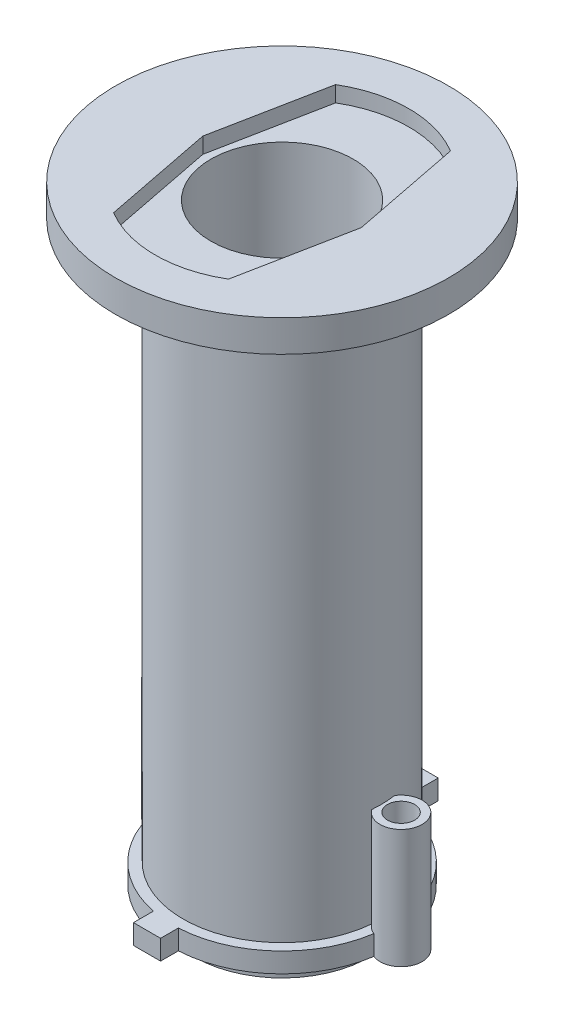
ISO-10303-21;
HEADER;
FILE_DESCRIPTION(('STEP AP214'),'2;1');
FILE_NAME('part.step','',(''),(''),'','','');
FILE_SCHEMA(('AUTOMOTIVE_DESIGN { 1 0 10303 214 1 1 1 1 }'));
ENDSEC;
DATA;
#1=APPLICATION_CONTEXT('core data for automotive mechanical design processes');
#2=APPLICATION_PROTOCOL_DEFINITION('international standard','automotive_design',2000,#1);
#3=PRODUCT_CONTEXT('',#1,'mechanical');
#4=PRODUCT('Part','Part','',(#3));
#5=PRODUCT_RELATED_PRODUCT_CATEGORY('part','',(#4));
#6=PRODUCT_DEFINITION_FORMATION('','',#4);
#7=PRODUCT_DEFINITION_CONTEXT('part definition',#1,'design');
#8=PRODUCT_DEFINITION('design','',#6,#7);
#9=PRODUCT_DEFINITION_SHAPE('','',#8);
#10=(LENGTH_UNIT() NAMED_UNIT(*) SI_UNIT(.MILLI.,.METRE.));
#11=(NAMED_UNIT(*) PLANE_ANGLE_UNIT() SI_UNIT($,.RADIAN.));
#12=(NAMED_UNIT(*) SI_UNIT($,.STERADIAN.) SOLID_ANGLE_UNIT());
#13=UNCERTAINTY_MEASURE_WITH_UNIT(LENGTH_MEASURE(1.E-05),#10,'distance_accuracy_value','');
#14=(GEOMETRIC_REPRESENTATION_CONTEXT(3) GLOBAL_UNCERTAINTY_ASSIGNED_CONTEXT((#13)) GLOBAL_UNIT_ASSIGNED_CONTEXT((#10,
#11,#12)) REPRESENTATION_CONTEXT('',''));
#15=CARTESIAN_POINT('',(0.,0.,0.));
#16=DIRECTION('',(0.,0.,1.));
#17=DIRECTION('',(1.,0.,0.));
#18=AXIS2_PLACEMENT_3D('',#15,#16,#17);
#19=CARTESIAN_POINT('',(-0.0762000000000037,2.5,1.51384));
#20=DIRECTION('',(0.,1.,0.));
#21=DIRECTION('',(0.,0.,1.));
#22=AXIS2_PLACEMENT_3D('',#19,#20,#21);
#23=PLANE('',#22);
#24=CARTESIAN_POINT('',(-14.5034,2.5,1.0795));
#25=DIRECTION('',(0.,1.,0.));
#26=DIRECTION('',(0.,0.,1.));
#27=AXIS2_PLACEMENT_3D('',#24,#25,#26);
#28=CIRCLE('',#27,2.6543);
#29=CARTESIAN_POINT('',(-12.3886077372189,2.5,-0.524545565213582));
#30=VERTEX_POINT('',#29);
#31=CARTESIAN_POINT('',(-13.5330312519173,2.5,-1.39106531642952));
#32=VERTEX_POINT('',#31);
#33=EDGE_CURVE('E272',#30,#32,#28,.T.);
#34=ORIENTED_EDGE('',*,*,#33,.F.);
#35=CARTESIAN_POINT('',(-0.0762000000000037,2.5,1.51384));
#36=DIRECTION('',(0.,1.,0.));
#37=DIRECTION('',(0.,0.,1.));
#38=AXIS2_PLACEMENT_3D('',#35,#36,#37);
#39=CIRCLE('',#38,12.48);
#40=CARTESIAN_POINT('',(12.2644264634765,2.5,-0.346089700000451));
#41=VERTEX_POINT('',#40);
#42=EDGE_CURVE('E417',#41,#30,#39,.T.);
#43=ORIENTED_EDGE('',*,*,#42,.F.);
#44=CARTESIAN_POINT('',(14.5034,2.5,1.0795));
#45=DIRECTION('',(0.,1.,0.));
#46=DIRECTION('',(0.,0.,1.));
#47=AXIS2_PLACEMENT_3D('',#44,#45,#46);
#48=CIRCLE('',#47,2.65430000000001);
#49=CARTESIAN_POINT('',(13.3933444870035,2.5,-1.33153406198795));
#50=VERTEX_POINT('',#49);
#51=EDGE_CURVE('E268',#50,#41,#48,.T.);
#52=ORIENTED_EDGE('',*,*,#51,.F.);
#53=CARTESIAN_POINT('',(-0.0762000000000037,2.5,1.51384));
#54=DIRECTION('',(0.,1.,0.));
#55=DIRECTION('',(0.,0.,1.));
#56=AXIS2_PLACEMENT_3D('',#53,#54,#55);
#57=CIRCLE('',#56,13.7668);
#58=CARTESIAN_POINT('',(0.597960957999996,2.5,-12.2364432422721));
#59=VERTEX_POINT('',#58);
#60=EDGE_CURVE('E191',#50,#59,#57,.T.);
#61=ORIENTED_EDGE('',*,*,#60,.T.);
#62=DIRECTION('',(0.,0.,-1.));
#63=VECTOR('',#62,1.);
#64=CARTESIAN_POINT('',(0.597960957999996,2.5,-12.2364432422721));
#65=LINE('',#64,#63);
#66=CARTESIAN_POINT('',(0.597960957999998,2.5,-17.5133));
#67=VERTEX_POINT('',#66);
#68=EDGE_CURVE('E113',#59,#67,#65,.T.);
#69=ORIENTED_EDGE('',*,*,#68,.T.);
#70=DIRECTION('',(-1.,0.,0.));
#71=VECTOR('',#70,1.);
#72=CARTESIAN_POINT('',(0.597960957999998,2.5,-17.5133));
#73=LINE('',#72,#71);
#74=CARTESIAN_POINT('',(-2.819411684,2.5,-17.5133));
#75=VERTEX_POINT('',#74);
#76=EDGE_CURVE('E238',#67,#75,#73,.T.);
#77=ORIENTED_EDGE('',*,*,#76,.T.);
#78=DIRECTION('',(0.,0.,1.));
#79=VECTOR('',#78,1.);
#80=CARTESIAN_POINT('',(-2.819411684,2.5,-17.5133));
#81=LINE('',#80,#79);
#82=CARTESIAN_POINT('',(-2.819411684,2.5,-11.9768816966612));
#83=VERTEX_POINT('',#82);
#84=EDGE_CURVE('E233',#75,#83,#81,.T.);
#85=ORIENTED_EDGE('',*,*,#84,.T.);
#86=CARTESIAN_POINT('',(-0.0762000000000037,2.5,1.51384));
#87=DIRECTION('',(0.,1.,0.));
#88=DIRECTION('',(0.,0.,1.));
#89=AXIS2_PLACEMENT_3D('',#86,#87,#88);
#90=CIRCLE('',#89,13.7668);
#91=EDGE_CURVE('E237',#83,#32,#90,.T.);
#92=ORIENTED_EDGE('',*,*,#91,.T.);
#93=EDGE_LOOP('',(#34,#43,#52,#61,#69,#77,#85,#92));
#94=FACE_BOUND('',#93,.T.);
#95=ADVANCED_FACE('F35',(#94),#23,.T.);
#96=CARTESIAN_POINT('',(12.3532611180342,2.5,2.63584548807739));
#97=VERTEX_POINT('',#96);
#98=CARTESIAN_POINT('',(13.5388396547462,2.5,3.55233882013443));
#99=VERTEX_POINT('',#98);
#100=EDGE_CURVE('E59',#97,#99,#48,.T.);
#101=ORIENTED_EDGE('',*,*,#100,.F.);
#102=CARTESIAN_POINT('',(-12.4889319057638,2.5,2.80785956539843));
#103=VERTEX_POINT('',#102);
#104=EDGE_CURVE('E264',#103,#97,#39,.T.);
#105=ORIENTED_EDGE('',*,*,#104,.F.);
#106=CARTESIAN_POINT('',(-13.6834098116879,2.5,3.60396520694422));
#107=VERTEX_POINT('',#106);
#108=EDGE_CURVE('E250',#107,#103,#28,.T.);
#109=ORIENTED_EDGE('',*,*,#108,.F.);
#110=CARTESIAN_POINT('',(-0.0762000000000037,2.5,1.51384));
#111=DIRECTION('',(0.,1.,0.));
#112=DIRECTION('',(0.,0.,1.));
#113=AXIS2_PLACEMENT_3D('',#110,#111,#112);
#114=CIRCLE('',#113,13.7668);
#115=CARTESIAN_POINT('',(-2.81941168400001,2.5,15.0045616966612));
#116=VERTEX_POINT('',#115);
#117=EDGE_CURVE('E240',#107,#116,#114,.T.);
#118=ORIENTED_EDGE('',*,*,#117,.T.);
#119=DIRECTION('',(0.,0.,1.));
#120=VECTOR('',#119,1.);
#121=CARTESIAN_POINT('',(-2.81941168400001,2.5,15.0045616966612));
#122=LINE('',#121,#120);
#123=CARTESIAN_POINT('',(-2.819411684,2.5,17.5133));
#124=VERTEX_POINT('',#123);
#125=EDGE_CURVE('E143',#116,#124,#122,.T.);
#126=ORIENTED_EDGE('',*,*,#125,.T.);
#127=DIRECTION('',(1.,0.,0.));
#128=VECTOR('',#127,1.);
#129=CARTESIAN_POINT('',(-2.819411684,2.5,17.5133));
#130=LINE('',#129,#128);
#131=CARTESIAN_POINT('',(0.597960957999998,2.5,17.5133));
#132=VERTEX_POINT('',#131);
#133=EDGE_CURVE('E136',#124,#132,#130,.T.);
#134=ORIENTED_EDGE('',*,*,#133,.T.);
#135=DIRECTION('',(0.,0.,-1.));
#136=VECTOR('',#135,1.);
#137=CARTESIAN_POINT('',(0.597960957999998,2.5,17.5133));
#138=LINE('',#137,#136);
#139=CARTESIAN_POINT('',(0.597960957999998,2.5,15.2641232422721));
#140=VERTEX_POINT('',#139);
#141=EDGE_CURVE('E140',#132,#140,#138,.T.);
#142=ORIENTED_EDGE('',*,*,#141,.T.);
#143=CARTESIAN_POINT('',(-0.0762000000000037,2.5,1.51384));
#144=DIRECTION('',(0.,1.,0.));
#145=DIRECTION('',(0.,0.,1.));
#146=AXIS2_PLACEMENT_3D('',#143,#144,#145);
#147=CIRCLE('',#146,13.7668);
#148=EDGE_CURVE('E161',#140,#99,#147,.T.);
#149=ORIENTED_EDGE('',*,*,#148,.T.);
#150=EDGE_LOOP('',(#101,#105,#109,#118,#126,#134,#142,#149));
#151=FACE_BOUND('',#150,.T.);
#152=ADVANCED_FACE('F138',(#151),#23,.T.);
#153=CARTESIAN_POINT('',(-14.5034,2.5,1.0795));
#154=DIRECTION('',(0.,-1.,0.));
#155=DIRECTION('',(0.,0.,-1.));
#156=AXIS2_PLACEMENT_3D('',#153,#154,#155);
#157=CYLINDRICAL_SURFACE('',#156,2.6543);
#158=DIRECTION('',(0.,-1.,0.));
#159=VECTOR('',#158,1.);
#160=CARTESIAN_POINT('',(-12.4889319057638,19.1525,2.80785956539843));
#161=LINE('',#160,#159);
#162=CARTESIAN_POINT('',(-12.4889319057638,15.,2.80785956539843));
#163=VERTEX_POINT('',#162);
#164=EDGE_CURVE('E406',#163,#103,#161,.T.);
#165=ORIENTED_EDGE('',*,*,#164,.F.);
#166=CARTESIAN_POINT('',(-14.5034,15.,1.0795));
#167=DIRECTION('',(0.,-1.,0.));
#168=DIRECTION('',(0.,0.,-1.));
#169=AXIS2_PLACEMENT_3D('',#166,#167,#168);
#170=CIRCLE('',#169,2.6543);
#171=CARTESIAN_POINT('',(-12.3886077372189,15.,-0.524545565213582));
#172=VERTEX_POINT('',#171);
#173=EDGE_CURVE('E418',#163,#172,#170,.T.);
#174=ORIENTED_EDGE('',*,*,#173,.T.);
#175=DIRECTION('',(0.,-1.,0.));
#176=VECTOR('',#175,1.);
#177=CARTESIAN_POINT('',(-12.3886077372189,19.1525,-0.524545565213585));
#178=LINE('',#177,#176);
#179=EDGE_CURVE('E411',#30,#172,#178,.F.);
#180=ORIENTED_EDGE('',*,*,#179,.F.);
#181=ORIENTED_EDGE('',*,*,#33,.T.);
#182=DIRECTION('',(0.,-1.,0.));
#183=VECTOR('',#182,1.);
#184=CARTESIAN_POINT('',(-13.5330312519173,2.5,-1.39106531642952));
#185=LINE('',#184,#183);
#186=CARTESIAN_POINT('',(-13.5330312519173,0.,-1.39106531642952));
#187=VERTEX_POINT('',#186);
#188=EDGE_CURVE('E203',#32,#187,#185,.T.);
#189=ORIENTED_EDGE('',*,*,#188,.T.);
#190=CARTESIAN_POINT('',(-14.5034,0.,1.0795));
#191=DIRECTION('',(0.,1.,0.));
#192=DIRECTION('',(0.,0.,1.));
#193=AXIS2_PLACEMENT_3D('',#190,#191,#192);
#194=CIRCLE('',#193,2.6543);
#195=CARTESIAN_POINT('',(-13.6834098116879,0.,3.60396520694422));
#196=VERTEX_POINT('',#195);
#197=EDGE_CURVE('E179',#187,#196,#194,.T.);
#198=ORIENTED_EDGE('',*,*,#197,.T.);
#199=DIRECTION('',(0.,-1.,0.));
#200=VECTOR('',#199,1.);
#201=CARTESIAN_POINT('',(-13.6834098116879,2.5,3.60396520694422));
#202=LINE('',#201,#200);
#203=EDGE_CURVE('E200',#107,#196,#202,.T.);
#204=ORIENTED_EDGE('',*,*,#203,.F.);
#205=ORIENTED_EDGE('',*,*,#108,.T.);
#206=EDGE_LOOP('',(#165,#174,#180,#181,#189,#198,#204,#205));
#207=FACE_BOUND('',#206,.T.);
#208=ADVANCED_FACE('F446',(#207),#157,.T.);
#209=CARTESIAN_POINT('',(14.5034,2.5,1.0795));
#210=DIRECTION('',(0.,-1.,0.));
#211=DIRECTION('',(0.,0.,-1.));
#212=AXIS2_PLACEMENT_3D('',#209,#210,#211);
#213=CYLINDRICAL_SURFACE('',#212,2.6543);
#214=DIRECTION('',(0.,-1.,0.));
#215=VECTOR('',#214,1.);
#216=CARTESIAN_POINT('',(12.2644264634765,19.1525,-0.346089700000466));
#217=LINE('',#216,#215);
#218=CARTESIAN_POINT('',(12.2644264634765,15.,-0.346089700000459));
#219=VERTEX_POINT('',#218);
#220=EDGE_CURVE('E294',#219,#41,#217,.T.);
#221=ORIENTED_EDGE('',*,*,#220,.F.);
#222=CARTESIAN_POINT('',(14.5034,15.,1.0795));
#223=DIRECTION('',(0.,-1.,0.));
#224=DIRECTION('',(0.,0.,-1.));
#225=AXIS2_PLACEMENT_3D('',#222,#223,#224);
#226=CIRCLE('',#225,2.6543);
#227=CARTESIAN_POINT('',(12.3532611180342,15.,2.6358454880774));
#228=VERTEX_POINT('',#227);
#229=EDGE_CURVE('E423',#219,#228,#226,.T.);
#230=ORIENTED_EDGE('',*,*,#229,.T.);
#231=DIRECTION('',(0.,-1.,0.));
#232=VECTOR('',#231,1.);
#233=CARTESIAN_POINT('',(12.3532611180342,19.1525,2.63584548807741));
#234=LINE('',#233,#232);
#235=EDGE_CURVE('E408',#97,#228,#234,.F.);
#236=ORIENTED_EDGE('',*,*,#235,.F.);
#237=ORIENTED_EDGE('',*,*,#100,.T.);
#238=DIRECTION('',(0.,-1.,0.));
#239=VECTOR('',#238,1.);
#240=CARTESIAN_POINT('',(13.5388396547462,2.5,3.55233882013443));
#241=LINE('',#240,#239);
#242=CARTESIAN_POINT('',(13.5388396547462,0.,3.55233882013443));
#243=VERTEX_POINT('',#242);
#244=EDGE_CURVE('E193',#99,#243,#241,.T.);
#245=ORIENTED_EDGE('',*,*,#244,.T.);
#246=CARTESIAN_POINT('',(14.5034,0.,1.0795));
#247=DIRECTION('',(0.,1.,0.));
#248=DIRECTION('',(0.,0.,1.));
#249=AXIS2_PLACEMENT_3D('',#246,#247,#248);
#250=CIRCLE('',#249,2.6543);
#251=CARTESIAN_POINT('',(13.3933444870035,0.,-1.33153406198795));
#252=VERTEX_POINT('',#251);
#253=EDGE_CURVE('E104',#243,#252,#250,.T.);
#254=ORIENTED_EDGE('',*,*,#253,.T.);
#255=DIRECTION('',(0.,-1.,0.));
#256=VECTOR('',#255,1.);
#257=CARTESIAN_POINT('',(13.3933444870035,2.5,-1.33153406198795));
#258=LINE('',#257,#256);
#259=EDGE_CURVE('E163',#50,#252,#258,.T.);
#260=ORIENTED_EDGE('',*,*,#259,.F.);
#261=ORIENTED_EDGE('',*,*,#51,.T.);
#262=EDGE_LOOP('',(#221,#230,#236,#237,#245,#254,#260,#261));
#263=FACE_BOUND('',#262,.T.);
#264=ADVANCED_FACE('F290',(#263),#213,.T.);
#265=CARTESIAN_POINT('',(-0.0762000000000037,72.805,1.51384));
#266=DIRECTION('',(0.,1.,0.));
#267=DIRECTION('',(0.,0.,1.));
#268=AXIS2_PLACEMENT_3D('',#265,#266,#267);
#269=PLANE('',#268);
#270=CARTESIAN_POINT('',(-0.0762000000000037,72.805,1.51384));
#271=DIRECTION('',(0.,1.,0.));
#272=DIRECTION('',(0.,0.,1.));
#273=AXIS2_PLACEMENT_3D('',#270,#271,#272);
#274=CIRCLE('',#273,21.);
#275=CARTESIAN_POINT('',(-0.0762000000000037,72.805,22.51384));
#276=VERTEX_POINT('',#275);
#277=EDGE_CURVE('E274',#276,#276,#274,.T.);
#278=ORIENTED_EDGE('',*,*,#277,.F.);
#279=EDGE_LOOP('',(#278));
#280=FACE_BOUND('',#279,.T.);
#281=CARTESIAN_POINT('',(-0.0762000000000037,72.805,1.51384));
#282=DIRECTION('',(0.,1.,0.));
#283=DIRECTION('',(0.,0.,1.));
#284=AXIS2_PLACEMENT_3D('',#281,#282,#283);
#285=CIRCLE('',#284,12.48);
#286=CARTESIAN_POINT('',(-0.0762000000000037,72.805,13.99384));
#287=VERTEX_POINT('',#286);
#288=EDGE_CURVE('E415',#287,#287,#285,.T.);
#289=ORIENTED_EDGE('',*,*,#288,.T.);
#290=EDGE_LOOP('',(#289));
#291=FACE_BOUND('',#290,.T.);
#292=ADVANCED_FACE('F476',(#280,#291),#269,.F.);
#293=CARTESIAN_POINT('',(-0.0762000000000037,2.5,1.51384));
#294=DIRECTION('',(0.,-1.,0.));
#295=DIRECTION('',(0.,0.,-1.));
#296=AXIS2_PLACEMENT_3D('',#293,#294,#295);
#297=CYLINDRICAL_SURFACE('',#296,13.7668);
#298=CARTESIAN_POINT('',(-0.0762000000000037,0.,1.51384));
#299=DIRECTION('',(0.,1.,0.));
#300=DIRECTION('',(0.,0.,1.));
#301=AXIS2_PLACEMENT_3D('',#298,#299,#300);
#302=CIRCLE('',#301,13.7668);
#303=CARTESIAN_POINT('',(0.597960957999996,0.,-12.2364432422721));
#304=VERTEX_POINT('',#303);
#305=EDGE_CURVE('E167',#252,#304,#302,.T.);
#306=ORIENTED_EDGE('',*,*,#305,.T.);
#307=DIRECTION('',(0.,-1.,0.));
#308=VECTOR('',#307,1.);
#309=CARTESIAN_POINT('',(0.597960957999996,2.5,-12.2364432422721));
#310=LINE('',#309,#308);
#311=EDGE_CURVE('E43',#59,#304,#310,.T.);
#312=ORIENTED_EDGE('',*,*,#311,.F.);
#313=ORIENTED_EDGE('',*,*,#60,.F.);
#314=ORIENTED_EDGE('',*,*,#259,.T.);
#315=EDGE_LOOP('',(#306,#312,#313,#314));
#316=FACE_BOUND('',#315,.T.);
#317=ADVANCED_FACE('F37',(#316),#297,.T.);
#318=CARTESIAN_POINT('',(0.597960957999996,2.5,-12.2364432422721));
#319=DIRECTION('',(-1.,0.,0.));
#320=DIRECTION('',(0.,0.,1.));
#321=AXIS2_PLACEMENT_3D('',#318,#319,#320);
#322=PLANE('',#321);
#323=DIRECTION('',(0.,0.,-1.));
#324=VECTOR('',#323,1.);
#325=CARTESIAN_POINT('',(0.597960957999996,0.,-12.2364432422721));
#326=LINE('',#325,#324);
#327=CARTESIAN_POINT('',(0.597960957999998,0.,-17.5133));
#328=VERTEX_POINT('',#327);
#329=EDGE_CURVE('E170',#304,#328,#326,.T.);
#330=ORIENTED_EDGE('',*,*,#329,.T.);
#331=DIRECTION('',(0.,-1.,0.));
#332=VECTOR('',#331,1.);
#333=CARTESIAN_POINT('',(0.597960957999998,2.5,-17.5133));
#334=LINE('',#333,#332);
#335=EDGE_CURVE('E212',#67,#328,#334,.T.);
#336=ORIENTED_EDGE('',*,*,#335,.F.);
#337=ORIENTED_EDGE('',*,*,#68,.F.);
#338=ORIENTED_EDGE('',*,*,#311,.T.);
#339=EDGE_LOOP('',(#330,#336,#337,#338));
#340=FACE_BOUND('',#339,.T.);
#341=ADVANCED_FACE('F215',(#340),#322,.F.);
#342=CARTESIAN_POINT('',(0.597960957999998,2.5,-17.5133));
#343=DIRECTION('',(0.,0.,1.));
#344=DIRECTION('',(1.,0.,0.));
#345=AXIS2_PLACEMENT_3D('',#342,#343,#344);
#346=PLANE('',#345);
#347=DIRECTION('',(-1.,0.,0.));
#348=VECTOR('',#347,1.);
#349=CARTESIAN_POINT('',(0.597960957999998,0.,-17.5133));
#350=LINE('',#349,#348);
#351=CARTESIAN_POINT('',(-2.819411684,0.,-17.5133));
#352=VERTEX_POINT('',#351);
#353=EDGE_CURVE('E173',#328,#352,#350,.T.);
#354=ORIENTED_EDGE('',*,*,#353,.T.);
#355=DIRECTION('',(0.,-1.,0.));
#356=VECTOR('',#355,1.);
#357=CARTESIAN_POINT('',(-2.819411684,2.5,-17.5133));
#358=LINE('',#357,#356);
#359=EDGE_CURVE('E209',#75,#352,#358,.T.);
#360=ORIENTED_EDGE('',*,*,#359,.F.);
#361=ORIENTED_EDGE('',*,*,#76,.F.);
#362=ORIENTED_EDGE('',*,*,#335,.T.);
#363=EDGE_LOOP('',(#354,#360,#361,#362));
#364=FACE_BOUND('',#363,.T.);
#365=ADVANCED_FACE('F227',(#364),#346,.F.);
#366=CARTESIAN_POINT('',(-2.819411684,2.5,-17.5133));
#367=DIRECTION('',(1.,0.,0.));
#368=DIRECTION('',(0.,0.,-1.));
#369=AXIS2_PLACEMENT_3D('',#366,#367,#368);
#370=PLANE('',#369);
#371=DIRECTION('',(0.,0.,1.));
#372=VECTOR('',#371,1.);
#373=CARTESIAN_POINT('',(-2.819411684,0.,-17.5133));
#374=LINE('',#373,#372);
#375=CARTESIAN_POINT('',(-2.819411684,0.,-11.9768816966612));
#376=VERTEX_POINT('',#375);
#377=EDGE_CURVE('E175',#352,#376,#374,.T.);
#378=ORIENTED_EDGE('',*,*,#377,.T.);
#379=DIRECTION('',(0.,-1.,0.));
#380=VECTOR('',#379,1.);
#381=CARTESIAN_POINT('',(-2.819411684,2.5,-11.9768816966612));
#382=LINE('',#381,#380);
#383=EDGE_CURVE('E206',#83,#376,#382,.T.);
#384=ORIENTED_EDGE('',*,*,#383,.F.);
#385=ORIENTED_EDGE('',*,*,#84,.F.);
#386=ORIENTED_EDGE('',*,*,#359,.T.);
#387=EDGE_LOOP('',(#378,#384,#385,#386));
#388=FACE_BOUND('',#387,.T.);
#389=ADVANCED_FACE('F231',(#388),#370,.F.);
#390=CARTESIAN_POINT('',(-0.0762000000000037,2.5,1.51384));
#391=DIRECTION('',(0.,-1.,0.));
#392=DIRECTION('',(0.,0.,-1.));
#393=AXIS2_PLACEMENT_3D('',#390,#391,#392);
#394=CYLINDRICAL_SURFACE('',#393,13.7668);
#395=CARTESIAN_POINT('',(-0.0762000000000037,0.,1.51384));
#396=DIRECTION('',(0.,1.,0.));
#397=DIRECTION('',(0.,0.,1.));
#398=AXIS2_PLACEMENT_3D('',#395,#396,#397);
#399=CIRCLE('',#398,13.7668);
#400=EDGE_CURVE('E177',#376,#187,#399,.T.);
#401=ORIENTED_EDGE('',*,*,#400,.T.);
#402=ORIENTED_EDGE('',*,*,#188,.F.);
#403=ORIENTED_EDGE('',*,*,#91,.F.);
#404=ORIENTED_EDGE('',*,*,#383,.T.);
#405=EDGE_LOOP('',(#401,#402,#403,#404));
#406=FACE_BOUND('',#405,.T.);
#407=ADVANCED_FACE('F452',(#406),#394,.T.);
#408=CARTESIAN_POINT('',(-0.0762000000000037,2.5,1.51384));
#409=DIRECTION('',(0.,-1.,0.));
#410=DIRECTION('',(0.,0.,-1.));
#411=AXIS2_PLACEMENT_3D('',#408,#409,#410);
#412=CYLINDRICAL_SURFACE('',#411,13.7668);
#413=CARTESIAN_POINT('',(-0.0762000000000037,0.,1.51384));
#414=DIRECTION('',(0.,1.,0.));
#415=DIRECTION('',(0.,0.,1.));
#416=AXIS2_PLACEMENT_3D('',#413,#414,#415);
#417=CIRCLE('',#416,13.7668);
#418=CARTESIAN_POINT('',(-2.81941168400001,0.,15.0045616966612));
#419=VERTEX_POINT('',#418);
#420=EDGE_CURVE('E181',#196,#419,#417,.T.);
#421=ORIENTED_EDGE('',*,*,#420,.T.);
#422=DIRECTION('',(0.,-1.,0.));
#423=VECTOR('',#422,1.);
#424=CARTESIAN_POINT('',(-2.81941168400001,2.5,15.0045616966612));
#425=LINE('',#424,#423);
#426=EDGE_CURVE('E197',#116,#419,#425,.T.);
#427=ORIENTED_EDGE('',*,*,#426,.F.);
#428=ORIENTED_EDGE('',*,*,#117,.F.);
#429=ORIENTED_EDGE('',*,*,#203,.T.);
#430=EDGE_LOOP('',(#421,#427,#428,#429));
#431=FACE_BOUND('',#430,.T.);
#432=ADVANCED_FACE('F253',(#431),#412,.T.);
#433=CARTESIAN_POINT('',(-2.81941168400001,2.5,15.0045616966612));
#434=DIRECTION('',(1.,0.,0.));
#435=DIRECTION('',(0.,0.,-1.));
#436=AXIS2_PLACEMENT_3D('',#433,#434,#435);
#437=PLANE('',#436);
#438=DIRECTION('',(0.,0.,1.));
#439=VECTOR('',#438,1.);
#440=CARTESIAN_POINT('',(-2.81941168400001,0.,15.0045616966612));
#441=LINE('',#440,#439);
#442=CARTESIAN_POINT('',(-2.819411684,0.,17.5133));
#443=VERTEX_POINT('',#442);
#444=EDGE_CURVE('E183',#419,#443,#441,.T.);
#445=ORIENTED_EDGE('',*,*,#444,.T.);
#446=DIRECTION('',(0.,-1.,0.));
#447=VECTOR('',#446,1.);
#448=CARTESIAN_POINT('',(-2.819411684,2.5,17.5133));
#449=LINE('',#448,#447);
#450=EDGE_CURVE('E155',#124,#443,#449,.T.);
#451=ORIENTED_EDGE('',*,*,#450,.F.);
#452=ORIENTED_EDGE('',*,*,#125,.F.);
#453=ORIENTED_EDGE('',*,*,#426,.T.);
#454=EDGE_LOOP('',(#445,#451,#452,#453));
#455=FACE_BOUND('',#454,.T.);
#456=ADVANCED_FACE('F257',(#455),#437,.F.);
#457=CARTESIAN_POINT('',(-2.819411684,2.5,17.5133));
#458=DIRECTION('',(0.,0.,-1.));
#459=DIRECTION('',(-1.,0.,0.));
#460=AXIS2_PLACEMENT_3D('',#457,#458,#459);
#461=PLANE('',#460);
#462=DIRECTION('',(1.,0.,0.));
#463=VECTOR('',#462,1.);
#464=CARTESIAN_POINT('',(-2.819411684,0.,17.5133));
#465=LINE('',#464,#463);
#466=CARTESIAN_POINT('',(0.597960957999998,0.,17.5133));
#467=VERTEX_POINT('',#466);
#468=EDGE_CURVE('E152',#443,#467,#465,.T.);
#469=ORIENTED_EDGE('',*,*,#468,.T.);
#470=DIRECTION('',(0.,-1.,0.));
#471=VECTOR('',#470,1.);
#472=CARTESIAN_POINT('',(0.597960957999998,2.5,17.5133));
#473=LINE('',#472,#471);
#474=EDGE_CURVE('E149',#132,#467,#473,.T.);
#475=ORIENTED_EDGE('',*,*,#474,.F.);
#476=ORIENTED_EDGE('',*,*,#133,.F.);
#477=ORIENTED_EDGE('',*,*,#450,.T.);
#478=EDGE_LOOP('',(#469,#475,#476,#477));
#479=FACE_BOUND('',#478,.T.);
#480=ADVANCED_FACE('F150',(#479),#461,.F.);
#481=CARTESIAN_POINT('',(0.597960957999998,2.5,17.5133));
#482=DIRECTION('',(-1.,0.,0.));
#483=DIRECTION('',(0.,0.,1.));
#484=AXIS2_PLACEMENT_3D('',#481,#482,#483);
#485=PLANE('',#484);
#486=DIRECTION('',(0.,0.,-1.));
#487=VECTOR('',#486,1.);
#488=CARTESIAN_POINT('',(0.597960957999998,0.,17.5133));
#489=LINE('',#488,#487);
#490=CARTESIAN_POINT('',(0.597960957999998,0.,15.2641232422721));
#491=VERTEX_POINT('',#490);
#492=EDGE_CURVE('E186',#467,#491,#489,.T.);
#493=ORIENTED_EDGE('',*,*,#492,.T.);
#494=DIRECTION('',(0.,-1.,0.));
#495=VECTOR('',#494,1.);
#496=CARTESIAN_POINT('',(0.597960957999998,2.5,15.2641232422721));
#497=LINE('',#496,#495);
#498=EDGE_CURVE('E156',#140,#491,#497,.T.);
#499=ORIENTED_EDGE('',*,*,#498,.F.);
#500=ORIENTED_EDGE('',*,*,#141,.F.);
#501=ORIENTED_EDGE('',*,*,#474,.T.);
#502=EDGE_LOOP('',(#493,#499,#500,#501));
#503=FACE_BOUND('',#502,.T.);
#504=ADVANCED_FACE('F158',(#503),#485,.F.);
#505=CARTESIAN_POINT('',(-0.0762000000000037,2.5,1.51384));
#506=DIRECTION('',(0.,-1.,0.));
#507=DIRECTION('',(0.,0.,-1.));
#508=AXIS2_PLACEMENT_3D('',#505,#506,#507);
#509=CYLINDRICAL_SURFACE('',#508,13.7668);
#510=CARTESIAN_POINT('',(-0.0762000000000037,0.,1.51384));
#511=DIRECTION('',(0.,1.,0.));
#512=DIRECTION('',(0.,0.,1.));
#513=AXIS2_PLACEMENT_3D('',#510,#511,#512);
#514=CIRCLE('',#513,13.7668);
#515=EDGE_CURVE('E188',#491,#243,#514,.T.);
#516=ORIENTED_EDGE('',*,*,#515,.T.);
#517=ORIENTED_EDGE('',*,*,#244,.F.);
#518=ORIENTED_EDGE('',*,*,#148,.F.);
#519=ORIENTED_EDGE('',*,*,#498,.T.);
#520=EDGE_LOOP('',(#516,#517,#518,#519));
#521=FACE_BOUND('',#520,.T.);
#522=ADVANCED_FACE('F259',(#521),#509,.T.);
#523=CARTESIAN_POINT('',(-0.0762000000000037,0.,1.51384));
#524=DIRECTION('',(0.,1.,0.));
#525=DIRECTION('',(0.,0.,1.));
#526=AXIS2_PLACEMENT_3D('',#523,#524,#525);
#527=PLANE('',#526);
#528=CARTESIAN_POINT('',(-0.0762000000000054,0.,1.51384));
#529=DIRECTION('',(0.,1.,0.));
#530=DIRECTION('',(0.,0.,1.));
#531=AXIS2_PLACEMENT_3D('',#528,#529,#530);
#532=CIRCLE('',#531,11.0744);
#533=CARTESIAN_POINT('',(-0.0762000000000054,0.,12.58824));
#534=VERTEX_POINT('',#533);
#535=EDGE_CURVE('E11',#534,#534,#532,.F.);
#536=ORIENTED_EDGE('',*,*,#535,.F.);
#537=EDGE_LOOP('',(#536));
#538=FACE_BOUND('',#537,.T.);
#539=CARTESIAN_POINT('',(14.5034,0.,1.0795));
#540=DIRECTION('',(0.,1.,0.));
#541=DIRECTION('',(0.,0.,1.));
#542=AXIS2_PLACEMENT_3D('',#539,#540,#541);
#543=CIRCLE('',#542,1.715);
#544=CARTESIAN_POINT('',(14.5034,0.,2.7945));
#545=VERTEX_POINT('',#544);
#546=EDGE_CURVE('E279',#545,#545,#543,.F.);
#547=ORIENTED_EDGE('',*,*,#546,.F.);
#548=EDGE_LOOP('',(#547));
#549=FACE_BOUND('',#548,.T.);
#550=CARTESIAN_POINT('',(-14.5034,0.,1.0795));
#551=DIRECTION('',(0.,1.,0.));
#552=DIRECTION('',(0.,0.,1.));
#553=AXIS2_PLACEMENT_3D('',#550,#551,#552);
#554=CIRCLE('',#553,1.715);
#555=CARTESIAN_POINT('',(-14.5034,0.,2.7945));
#556=VERTEX_POINT('',#555);
#557=EDGE_CURVE('E171',#556,#556,#554,.F.);
#558=ORIENTED_EDGE('',*,*,#557,.F.);
#559=EDGE_LOOP('',(#558));
#560=FACE_BOUND('',#559,.T.);
#561=ORIENTED_EDGE('',*,*,#305,.F.);
#562=ORIENTED_EDGE('',*,*,#253,.F.);
#563=ORIENTED_EDGE('',*,*,#515,.F.);
#564=ORIENTED_EDGE('',*,*,#492,.F.);
#565=ORIENTED_EDGE('',*,*,#468,.F.);
#566=ORIENTED_EDGE('',*,*,#444,.F.);
#567=ORIENTED_EDGE('',*,*,#420,.F.);
#568=ORIENTED_EDGE('',*,*,#197,.F.);
#569=ORIENTED_EDGE('',*,*,#400,.F.);
#570=ORIENTED_EDGE('',*,*,#377,.F.);
#571=ORIENTED_EDGE('',*,*,#353,.F.);
#572=ORIENTED_EDGE('',*,*,#329,.F.);
#573=EDGE_LOOP('',(#561,#562,#563,#564,#565,#566,#567,#568,#569,#570,#571,#572));
#574=FACE_BOUND('',#573,.T.);
#575=ADVANCED_FACE('F220',(#538,#549,#560,#574),#527,.F.);
#576=CARTESIAN_POINT('',(-14.5034,-0.00100000000000013,1.0795));
#577=DIRECTION('',(0.,1.,0.));
#578=DIRECTION('',(0.,0.,1.));
#579=AXIS2_PLACEMENT_3D('',#576,#577,#578);
#580=CYLINDRICAL_SURFACE('',#579,1.715);
#581=ORIENTED_EDGE('',*,*,#557,.T.);
#582=EDGE_LOOP('',(#581));
#583=FACE_BOUND('',#582,.T.);
#584=CARTESIAN_POINT('',(-14.5034,15.,1.0795));
#585=DIRECTION('',(0.,-1.,0.));
#586=DIRECTION('',(0.,0.,-1.));
#587=AXIS2_PLACEMENT_3D('',#584,#585,#586);
#588=CIRCLE('',#587,1.715);
#589=CARTESIAN_POINT('',(-14.5034,15.,-0.635500000000002));
#590=VERTEX_POINT('',#589);
#591=EDGE_CURVE('E425',#590,#590,#588,.F.);
#592=ORIENTED_EDGE('',*,*,#591,.T.);
#593=EDGE_LOOP('',(#592));
#594=FACE_BOUND('',#593,.T.);
#595=ADVANCED_FACE('F469',(#583,#594),#580,.F.);
#596=CARTESIAN_POINT('',(-0.0762000000000037,-0.00100000000000013,1.51384));
#597=DIRECTION('',(0.,1.,0.));
#598=DIRECTION('',(0.,0.,1.));
#599=AXIS2_PLACEMENT_3D('',#596,#597,#598);
#600=CYLINDRICAL_SURFACE('',#599,8.98);
#601=CARTESIAN_POINT('',(-0.0762000000000037,-2.35,1.51384));
#602=DIRECTION('',(0.,-1.,0.));
#603=DIRECTION('',(0.,0.,-1.));
#604=AXIS2_PLACEMENT_3D('',#601,#602,#603);
#605=CIRCLE('',#604,8.98);
#606=CARTESIAN_POINT('',(-0.0762000000000037,-2.35,-7.46616));
#607=VERTEX_POINT('',#606);
#608=EDGE_CURVE('E403',#607,#607,#605,.F.);
#609=ORIENTED_EDGE('',*,*,#608,.F.);
#610=EDGE_LOOP('',(#609));
#611=FACE_BOUND('',#610,.T.);
#612=CARTESIAN_POINT('',(-0.0762000000000037,74.805,1.51384));
#613=DIRECTION('',(0.,1.,0.));
#614=DIRECTION('',(0.,0.,1.));
#615=AXIS2_PLACEMENT_3D('',#612,#613,#614);
#616=CIRCLE('',#615,8.98);
#617=CARTESIAN_POINT('',(-0.0762000000000037,74.805,10.49384));
#618=VERTEX_POINT('',#617);
#619=EDGE_CURVE('E359',#618,#618,#616,.T.);
#620=ORIENTED_EDGE('',*,*,#619,.T.);
#621=EDGE_LOOP('',(#620));
#622=FACE_BOUND('',#621,.T.);
#623=ADVANCED_FACE('F579',(#611,#622),#600,.F.);
#624=CARTESIAN_POINT('',(14.5034,-0.00100000000000013,1.0795));
#625=DIRECTION('',(0.,1.,0.));
#626=DIRECTION('',(0.,0.,1.));
#627=AXIS2_PLACEMENT_3D('',#624,#625,#626);
#628=CYLINDRICAL_SURFACE('',#627,1.715);
#629=ORIENTED_EDGE('',*,*,#546,.T.);
#630=EDGE_LOOP('',(#629));
#631=FACE_BOUND('',#630,.T.);
#632=CARTESIAN_POINT('',(14.5034,15.,1.0795));
#633=DIRECTION('',(0.,-1.,0.));
#634=DIRECTION('',(0.,0.,-1.));
#635=AXIS2_PLACEMENT_3D('',#632,#633,#634);
#636=CIRCLE('',#635,1.715);
#637=CARTESIAN_POINT('',(14.5034,15.,-0.635500000000004));
#638=VERTEX_POINT('',#637);
#639=EDGE_CURVE('E428',#638,#638,#636,.F.);
#640=ORIENTED_EDGE('',*,*,#639,.T.);
#641=EDGE_LOOP('',(#640));
#642=FACE_BOUND('',#641,.T.);
#643=ADVANCED_FACE('F587',(#631,#642),#628,.F.);
#644=CARTESIAN_POINT('',(-0.0762000000000037,76.805,1.51384));
#645=DIRECTION('',(0.,1.,0.));
#646=DIRECTION('',(0.,0.,1.));
#647=AXIS2_PLACEMENT_3D('',#644,#645,#646);
#648=PLANE('',#647);
#649=CARTESIAN_POINT('',(-0.0762000000000017,76.805,-0.345535000000039));
#650=DIRECTION('',(0.,1.,0.));
#651=DIRECTION('',(0.,0.,-1.));
#652=AXIS2_PLACEMENT_3D('',#649,#650,#651);
#653=CIRCLE('',#652,14.140625);
#654=CARTESIAN_POINT('',(7.1738,76.805,-12.48616));
#655=VERTEX_POINT('',#654);
#656=CARTESIAN_POINT('',(-7.32620000000001,76.805,-12.48616));
#657=VERTEX_POINT('',#656);
#658=EDGE_CURVE('E50',#655,#657,#653,.T.);
#659=ORIENTED_EDGE('',*,*,#658,.F.);
#660=DIRECTION('',(-0.192745304030928,0.,-0.981248820521087));
#661=VECTOR('',#660,1.);
#662=CARTESIAN_POINT('',(9.9238,76.805,1.51384));
#663=LINE('',#662,#661);
#664=CARTESIAN_POINT('',(9.9238,76.805,1.51384));
#665=VERTEX_POINT('',#664);
#666=EDGE_CURVE('E346',#665,#655,#663,.T.);
#667=ORIENTED_EDGE('',*,*,#666,.F.);
#668=DIRECTION('',(0.192745304030928,0.,-0.981248820521087));
#669=VECTOR('',#668,1.);
#670=CARTESIAN_POINT('',(7.1738,76.805,15.51384));
#671=LINE('',#670,#669);
#672=CARTESIAN_POINT('',(7.17379999999999,76.805,15.51384));
#673=VERTEX_POINT('',#672);
#674=EDGE_CURVE('E351',#673,#665,#671,.T.);
#675=ORIENTED_EDGE('',*,*,#674,.F.);
#676=CARTESIAN_POINT('',(-0.0762000000000089,76.805,3.37321499999991));
#677=DIRECTION('',(0.,1.,0.));
#678=DIRECTION('',(0.,0.,1.));
#679=AXIS2_PLACEMENT_3D('',#676,#677,#678);
#680=CIRCLE('',#679,14.1406250000001);
#681=CARTESIAN_POINT('',(-7.32620000000001,76.805,15.51384));
#682=VERTEX_POINT('',#681);
#683=EDGE_CURVE('E372',#682,#673,#680,.T.);
#684=ORIENTED_EDGE('',*,*,#683,.F.);
#685=DIRECTION('',(0.192745304030928,0.,0.981248820521087));
#686=VECTOR('',#685,1.);
#687=CARTESIAN_POINT('',(-10.0762,76.805,1.51384));
#688=LINE('',#687,#686);
#689=CARTESIAN_POINT('',(-10.0762,76.805,1.51384));
#690=VERTEX_POINT('',#689);
#691=EDGE_CURVE('E361',#690,#682,#688,.T.);
#692=ORIENTED_EDGE('',*,*,#691,.F.);
#693=DIRECTION('',(-0.192745304030928,0.,0.981248820521087));
#694=VECTOR('',#693,1.);
#695=CARTESIAN_POINT('',(-7.32620000000001,76.805,-12.48616));
#696=LINE('',#695,#694);
#697=EDGE_CURVE('E358',#657,#690,#696,.T.);
#698=ORIENTED_EDGE('',*,*,#697,.F.);
#699=EDGE_LOOP('',(#659,#667,#675,#684,#692,#698));
#700=FACE_BOUND('',#699,.T.);
#701=CARTESIAN_POINT('',(-0.0762000000000037,76.805,1.51384));
#702=DIRECTION('',(0.,1.,0.));
#703=DIRECTION('',(0.,0.,1.));
#704=AXIS2_PLACEMENT_3D('',#701,#702,#703);
#705=CIRCLE('',#704,21.);
#706=CARTESIAN_POINT('',(-0.0762000000000037,76.805,22.51384));
#707=VERTEX_POINT('',#706);
#708=EDGE_CURVE('E269',#707,#707,#705,.T.);
#709=ORIENTED_EDGE('',*,*,#708,.T.);
#710=EDGE_LOOP('',(#709));
#711=FACE_BOUND('',#710,.T.);
#712=ADVANCED_FACE('F354',(#700,#711),#648,.T.);
#713=CARTESIAN_POINT('',(-0.0762000000000037,76.805,1.51384));
#714=DIRECTION('',(0.,-1.,0.));
#715=DIRECTION('',(0.,0.,-1.));
#716=AXIS2_PLACEMENT_3D('',#713,#714,#715);
#717=CYLINDRICAL_SURFACE('',#716,21.);
#718=ORIENTED_EDGE('',*,*,#708,.F.);
#719=EDGE_LOOP('',(#718));
#720=FACE_BOUND('',#719,.T.);
#721=ORIENTED_EDGE('',*,*,#277,.T.);
#722=EDGE_LOOP('',(#721));
#723=FACE_BOUND('',#722,.T.);
#724=ADVANCED_FACE('F562',(#720,#723),#717,.T.);
#725=CARTESIAN_POINT('',(-0.0762000000000017,74.805,-0.345535000000039));
#726=DIRECTION('',(0.,1.,0.));
#727=DIRECTION('',(0.,0.,1.));
#728=AXIS2_PLACEMENT_3D('',#725,#726,#727);
#729=CYLINDRICAL_SURFACE('',#728,14.140625);
#730=ORIENTED_EDGE('',*,*,#658,.T.);
#731=DIRECTION('',(0.,1.,0.));
#732=VECTOR('',#731,1.);
#733=CARTESIAN_POINT('',(-7.32620000000001,74.805,-12.48616));
#734=LINE('',#733,#732);
#735=CARTESIAN_POINT('',(-7.32620000000001,74.805,-12.48616));
#736=VERTEX_POINT('',#735);
#737=EDGE_CURVE('E383',#736,#657,#734,.T.);
#738=ORIENTED_EDGE('',*,*,#737,.F.);
#739=CARTESIAN_POINT('',(-0.0762000000000017,74.805,-0.345535000000039));
#740=DIRECTION('',(0.,1.,0.));
#741=DIRECTION('',(0.,0.,-1.));
#742=AXIS2_PLACEMENT_3D('',#739,#740,#741);
#743=CIRCLE('',#742,14.140625);
#744=CARTESIAN_POINT('',(7.1738,74.805,-12.48616));
#745=VERTEX_POINT('',#744);
#746=EDGE_CURVE('E339',#745,#736,#743,.T.);
#747=ORIENTED_EDGE('',*,*,#746,.F.);
#748=DIRECTION('',(0.,1.,0.));
#749=VECTOR('',#748,1.);
#750=CARTESIAN_POINT('',(7.1738,74.805,-12.48616));
#751=LINE('',#750,#749);
#752=EDGE_CURVE('E335',#745,#655,#751,.T.);
#753=ORIENTED_EDGE('',*,*,#752,.T.);
#754=EDGE_LOOP('',(#730,#738,#747,#753));
#755=FACE_BOUND('',#754,.T.);
#756=ADVANCED_FACE('F337',(#755),#729,.F.);
#757=CARTESIAN_POINT('',(9.9238,74.805,1.51384));
#758=DIRECTION('',(0.981248820521087,0.,-0.192745304030928));
#759=DIRECTION('',(-0.192745304030928,0.,-0.981248820521087));
#760=AXIS2_PLACEMENT_3D('',#757,#758,#759);
#761=PLANE('',#760);
#762=ORIENTED_EDGE('',*,*,#666,.T.);
#763=ORIENTED_EDGE('',*,*,#752,.F.);
#764=DIRECTION('',(-0.192745304030928,0.,-0.981248820521087));
#765=VECTOR('',#764,1.);
#766=CARTESIAN_POINT('',(9.9238,74.805,1.51384));
#767=LINE('',#766,#765);
#768=CARTESIAN_POINT('',(9.9238,74.805,1.51384));
#769=VERTEX_POINT('',#768);
#770=EDGE_CURVE('E367',#769,#745,#767,.T.);
#771=ORIENTED_EDGE('',*,*,#770,.F.);
#772=DIRECTION('',(0.,1.,0.));
#773=VECTOR('',#772,1.);
#774=CARTESIAN_POINT('',(9.9238,74.805,1.51384));
#775=LINE('',#774,#773);
#776=EDGE_CURVE('E343',#769,#665,#775,.T.);
#777=ORIENTED_EDGE('',*,*,#776,.T.);
#778=EDGE_LOOP('',(#762,#763,#771,#777));
#779=FACE_BOUND('',#778,.T.);
#780=ADVANCED_FACE('F347',(#779),#761,.F.);
#781=CARTESIAN_POINT('',(7.1738,74.805,15.51384));
#782=DIRECTION('',(0.981248820521087,0.,0.192745304030928));
#783=DIRECTION('',(0.192745304030928,0.,-0.981248820521087));
#784=AXIS2_PLACEMENT_3D('',#781,#782,#783);
#785=PLANE('',#784);
#786=ORIENTED_EDGE('',*,*,#674,.T.);
#787=ORIENTED_EDGE('',*,*,#776,.F.);
#788=DIRECTION('',(0.192745304030928,0.,-0.981248820521087));
#789=VECTOR('',#788,1.);
#790=CARTESIAN_POINT('',(7.1738,74.805,15.51384));
#791=LINE('',#790,#789);
#792=CARTESIAN_POINT('',(7.17379999999999,74.805,15.51384));
#793=VERTEX_POINT('',#792);
#794=EDGE_CURVE('E386',#793,#769,#791,.T.);
#795=ORIENTED_EDGE('',*,*,#794,.F.);
#796=DIRECTION('',(0.,1.,0.));
#797=VECTOR('',#796,1.);
#798=CARTESIAN_POINT('',(7.17379999999999,74.805,15.51384));
#799=LINE('',#798,#797);
#800=EDGE_CURVE('E377',#793,#673,#799,.T.);
#801=ORIENTED_EDGE('',*,*,#800,.T.);
#802=EDGE_LOOP('',(#786,#787,#795,#801));
#803=FACE_BOUND('',#802,.T.);
#804=ADVANCED_FACE('F614',(#803),#785,.F.);
#805=CARTESIAN_POINT('',(-0.0762000000000089,74.805,3.37321499999991));
#806=DIRECTION('',(0.,1.,0.));
#807=DIRECTION('',(0.,0.,1.));
#808=AXIS2_PLACEMENT_3D('',#805,#806,#807);
#809=CYLINDRICAL_SURFACE('',#808,14.1406250000001);
#810=ORIENTED_EDGE('',*,*,#683,.T.);
#811=ORIENTED_EDGE('',*,*,#800,.F.);
#812=CARTESIAN_POINT('',(-0.0762000000000089,74.805,3.37321499999991));
#813=DIRECTION('',(0.,1.,0.));
#814=DIRECTION('',(0.,0.,1.));
#815=AXIS2_PLACEMENT_3D('',#812,#813,#814);
#816=CIRCLE('',#815,14.1406250000001);
#817=CARTESIAN_POINT('',(-7.32620000000001,74.805,15.51384));
#818=VERTEX_POINT('',#817);
#819=EDGE_CURVE('E389',#818,#793,#816,.T.);
#820=ORIENTED_EDGE('',*,*,#819,.F.);
#821=DIRECTION('',(0.,1.,0.));
#822=VECTOR('',#821,1.);
#823=CARTESIAN_POINT('',(-7.32620000000001,74.805,15.51384));
#824=LINE('',#823,#822);
#825=EDGE_CURVE('E379',#818,#682,#824,.T.);
#826=ORIENTED_EDGE('',*,*,#825,.T.);
#827=EDGE_LOOP('',(#810,#811,#820,#826));
#828=FACE_BOUND('',#827,.T.);
#829=ADVANCED_FACE('F623',(#828),#809,.F.);
#830=CARTESIAN_POINT('',(-10.0762,74.805,1.51384));
#831=DIRECTION('',(-0.981248820521087,0.,0.192745304030928));
#832=DIRECTION('',(0.192745304030928,0.,0.981248820521087));
#833=AXIS2_PLACEMENT_3D('',#830,#831,#832);
#834=PLANE('',#833);
#835=ORIENTED_EDGE('',*,*,#691,.T.);
#836=ORIENTED_EDGE('',*,*,#825,.F.);
#837=DIRECTION('',(0.192745304030928,0.,0.981248820521087));
#838=VECTOR('',#837,1.);
#839=CARTESIAN_POINT('',(-10.0762,74.805,1.51384));
#840=LINE('',#839,#838);
#841=CARTESIAN_POINT('',(-10.0762,74.805,1.51384));
#842=VERTEX_POINT('',#841);
#843=EDGE_CURVE('E392',#842,#818,#840,.T.);
#844=ORIENTED_EDGE('',*,*,#843,.F.);
#845=DIRECTION('',(0.,1.,0.));
#846=VECTOR('',#845,1.);
#847=CARTESIAN_POINT('',(-10.0762,74.805,1.51384));
#848=LINE('',#847,#846);
#849=EDGE_CURVE('E381',#842,#690,#848,.T.);
#850=ORIENTED_EDGE('',*,*,#849,.T.);
#851=EDGE_LOOP('',(#835,#836,#844,#850));
#852=FACE_BOUND('',#851,.T.);
#853=ADVANCED_FACE('F633',(#852),#834,.F.);
#854=CARTESIAN_POINT('',(-7.32620000000001,74.805,-12.48616));
#855=DIRECTION('',(-0.981248820521087,0.,-0.192745304030928));
#856=DIRECTION('',(-0.192745304030928,0.,0.981248820521087));
#857=AXIS2_PLACEMENT_3D('',#854,#855,#856);
#858=PLANE('',#857);
#859=ORIENTED_EDGE('',*,*,#697,.T.);
#860=ORIENTED_EDGE('',*,*,#849,.F.);
#861=DIRECTION('',(-0.192745304030928,0.,0.981248820521087));
#862=VECTOR('',#861,1.);
#863=CARTESIAN_POINT('',(-7.32620000000001,74.805,-12.48616));
#864=LINE('',#863,#862);
#865=EDGE_CURVE('E397',#736,#842,#864,.T.);
#866=ORIENTED_EDGE('',*,*,#865,.F.);
#867=ORIENTED_EDGE('',*,*,#737,.T.);
#868=EDGE_LOOP('',(#859,#860,#866,#867));
#869=FACE_BOUND('',#868,.T.);
#870=ADVANCED_FACE('F643',(#869),#858,.F.);
#871=CARTESIAN_POINT('',(-0.0762000000000017,74.805,-0.345535000000039));
#872=DIRECTION('',(0.,-1.,0.));
#873=DIRECTION('',(0.,0.,-1.));
#874=AXIS2_PLACEMENT_3D('',#871,#872,#873);
#875=PLANE('',#874);
#876=ORIENTED_EDGE('',*,*,#619,.F.);
#877=EDGE_LOOP('',(#876));
#878=FACE_BOUND('',#877,.T.);
#879=ORIENTED_EDGE('',*,*,#746,.T.);
#880=ORIENTED_EDGE('',*,*,#865,.T.);
#881=ORIENTED_EDGE('',*,*,#843,.T.);
#882=ORIENTED_EDGE('',*,*,#819,.T.);
#883=ORIENTED_EDGE('',*,*,#794,.T.);
#884=ORIENTED_EDGE('',*,*,#770,.T.);
#885=EDGE_LOOP('',(#879,#880,#881,#882,#883,#884));
#886=FACE_BOUND('',#885,.T.);
#887=ADVANCED_FACE('F653',(#878,#886),#875,.F.);
#888=CARTESIAN_POINT('',(-0.0762000000000054,-2.35,1.51384));
#889=DIRECTION('',(0.,1.,0.));
#890=DIRECTION('',(0.,0.,1.));
#891=AXIS2_PLACEMENT_3D('',#888,#889,#890);
#892=CYLINDRICAL_SURFACE('',#891,11.0744);
#893=CARTESIAN_POINT('',(-0.0762000000000054,-2.35,1.51384));
#894=DIRECTION('',(0.,-1.,0.));
#895=DIRECTION('',(0.,0.,-1.));
#896=AXIS2_PLACEMENT_3D('',#893,#894,#895);
#897=CIRCLE('',#896,11.0744);
#898=CARTESIAN_POINT('',(-0.0762000000000054,-2.35,-9.56056000000001));
#899=VERTEX_POINT('',#898);
#900=EDGE_CURVE('E364',#899,#899,#897,.T.);
#901=ORIENTED_EDGE('',*,*,#900,.F.);
#902=EDGE_LOOP('',(#901));
#903=FACE_BOUND('',#902,.T.);
#904=ORIENTED_EDGE('',*,*,#535,.T.);
#905=EDGE_LOOP('',(#904));
#906=FACE_BOUND('',#905,.T.);
#907=ADVANCED_FACE('F662',(#903,#906),#892,.T.);
#908=CARTESIAN_POINT('',(0.,-2.35,0.));
#909=DIRECTION('',(0.,-1.,0.));
#910=DIRECTION('',(0.,0.,-1.));
#911=AXIS2_PLACEMENT_3D('',#908,#909,#910);
#912=PLANE('',#911);
#913=ORIENTED_EDGE('',*,*,#608,.T.);
#914=EDGE_LOOP('',(#913));
#915=FACE_BOUND('',#914,.T.);
#916=ORIENTED_EDGE('',*,*,#900,.T.);
#917=EDGE_LOOP('',(#916));
#918=FACE_BOUND('',#917,.T.);
#919=ADVANCED_FACE('F678',(#915,#918),#912,.T.);
#920=CARTESIAN_POINT('',(-0.0762000000000037,108.103770516832,1.51384));
#921=DIRECTION('',(0.,-1.,0.));
#922=DIRECTION('',(0.,0.,-1.));
#923=AXIS2_PLACEMENT_3D('',#920,#921,#922);
#924=CYLINDRICAL_SURFACE('',#923,12.48);
#925=CARTESIAN_POINT('',(-0.0762000000000037,15.,1.51384));
#926=DIRECTION('',(0.,-1.,0.));
#927=DIRECTION('',(0.,0.,-1.));
#928=AXIS2_PLACEMENT_3D('',#925,#926,#927);
#929=CIRCLE('',#928,12.48);
#930=EDGE_CURVE('E433',#163,#172,#929,.T.);
#931=ORIENTED_EDGE('',*,*,#930,.F.);
#932=ORIENTED_EDGE('',*,*,#164,.T.);
#933=ORIENTED_EDGE('',*,*,#104,.T.);
#934=ORIENTED_EDGE('',*,*,#235,.T.);
#935=EDGE_CURVE('E431',#219,#228,#929,.T.);
#936=ORIENTED_EDGE('',*,*,#935,.F.);
#937=ORIENTED_EDGE('',*,*,#220,.T.);
#938=ORIENTED_EDGE('',*,*,#42,.T.);
#939=ORIENTED_EDGE('',*,*,#179,.T.);
#940=EDGE_LOOP('',(#931,#932,#933,#934,#936,#937,#938,#939));
#941=FACE_BOUND('',#940,.T.);
#942=ORIENTED_EDGE('',*,*,#288,.F.);
#943=EDGE_LOOP('',(#942));
#944=FACE_BOUND('',#943,.T.);
#945=ADVANCED_FACE('F447',(#941,#944),#924,.T.);
#946=CARTESIAN_POINT('',(-0.0762000000000037,15.,1.51384));
#947=DIRECTION('',(0.,-1.,0.));
#948=DIRECTION('',(0.,0.,-1.));
#949=AXIS2_PLACEMENT_3D('',#946,#947,#948);
#950=PLANE('',#949);
#951=ORIENTED_EDGE('',*,*,#591,.F.);
#952=EDGE_LOOP('',(#951));
#953=FACE_BOUND('',#952,.T.);
#954=ORIENTED_EDGE('',*,*,#930,.T.);
#955=ORIENTED_EDGE('',*,*,#173,.F.);
#956=EDGE_LOOP('',(#954,#955));
#957=FACE_BOUND('',#956,.T.);
#958=ADVANCED_FACE('F441',(#953,#957),#950,.F.);
#959=ORIENTED_EDGE('',*,*,#639,.F.);
#960=EDGE_LOOP('',(#959));
#961=FACE_BOUND('',#960,.T.);
#962=ORIENTED_EDGE('',*,*,#935,.T.);
#963=ORIENTED_EDGE('',*,*,#229,.F.);
#964=EDGE_LOOP('',(#962,#963));
#965=FACE_BOUND('',#964,.T.);
#966=ADVANCED_FACE('F741',(#961,#965),#950,.F.);
#967=CLOSED_SHELL('',(#95,#152,#208,#264,#292,#317,#341,#365,#389,#407,#432,#456,#480,#504,#522,
#575,#595,#623,#643,#712,#724,#756,#780,#804,#829,#853,#870,#887,#907,#919,#945,#958,#966));
#968=MANIFOLD_SOLID_BREP('B2',#967);
#969=ADVANCED_BREP_SHAPE_REPRESENTATION('',(#18,#968),#14);
#970=SHAPE_DEFINITION_REPRESENTATION(#9,#969);
ENDSEC;
END-ISO-10303-21;
